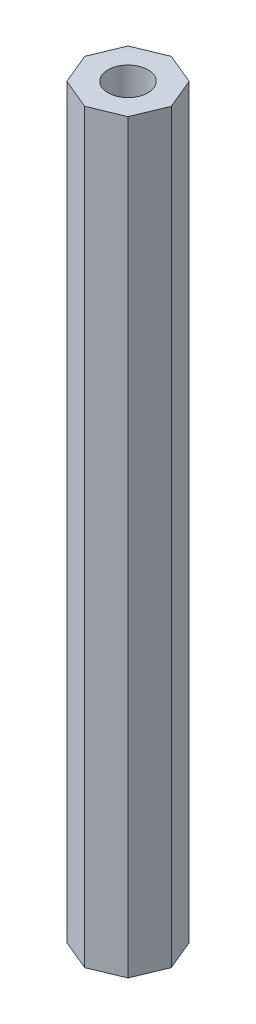
ISO-10303-21;
HEADER;
FILE_DESCRIPTION(('STEP AP214'),'2;1');
FILE_NAME('part.step','',(''),(''),'','','');
FILE_SCHEMA(('AUTOMOTIVE_DESIGN { 1 0 10303 214 1 1 1 1 }'));
ENDSEC;
DATA;
#1=APPLICATION_CONTEXT('core data for automotive mechanical design processes');
#2=APPLICATION_PROTOCOL_DEFINITION('international standard','automotive_design',2000,#1);
#3=PRODUCT_CONTEXT('',#1,'mechanical');
#4=PRODUCT('Part','Part','',(#3));
#5=PRODUCT_RELATED_PRODUCT_CATEGORY('part','',(#4));
#6=PRODUCT_DEFINITION_FORMATION('','',#4);
#7=PRODUCT_DEFINITION_CONTEXT('part definition',#1,'design');
#8=PRODUCT_DEFINITION('design','',#6,#7);
#9=PRODUCT_DEFINITION_SHAPE('','',#8);
#10=(LENGTH_UNIT() NAMED_UNIT(*) SI_UNIT(.MILLI.,.METRE.));
#11=(NAMED_UNIT(*) PLANE_ANGLE_UNIT() SI_UNIT($,.RADIAN.));
#12=(NAMED_UNIT(*) SI_UNIT($,.STERADIAN.) SOLID_ANGLE_UNIT());
#13=UNCERTAINTY_MEASURE_WITH_UNIT(LENGTH_MEASURE(1.E-05),#10,'distance_accuracy_value','');
#14=(GEOMETRIC_REPRESENTATION_CONTEXT(3) GLOBAL_UNCERTAINTY_ASSIGNED_CONTEXT((#13)) GLOBAL_UNIT_ASSIGNED_CONTEXT((#10,
#11,#12)) REPRESENTATION_CONTEXT('',''));
#15=CARTESIAN_POINT('',(0.,0.,0.));
#16=DIRECTION('',(0.,0.,1.));
#17=DIRECTION('',(1.,0.,0.));
#18=AXIS2_PLACEMENT_3D('',#15,#16,#17);
#19=CARTESIAN_POINT('',(0.,28.,0.));
#20=DIRECTION('',(0.,1.,0.));
#21=DIRECTION('',(0.,0.,1.));
#22=AXIS2_PLACEMENT_3D('',#19,#20,#21);
#23=PLANE('',#22);
#24=DIRECTION('',(0.382683432365078,0.,-0.923879532511292));
#25=VECTOR('',#24,1.);
#26=CARTESIAN_POINT('',(1.14805029709528,28.,1.14805029709526));
#27=LINE('',#26,#25);
#28=CARTESIAN_POINT('',(1.14805029709528,28.,1.14805029709526));
#29=VERTEX_POINT('',#28);
#30=CARTESIAN_POINT('',(1.62358830043859,28.,0.));
#31=VERTEX_POINT('',#30);
#32=EDGE_CURVE('E144',#29,#31,#27,.T.);
#33=ORIENTED_EDGE('',*,*,#32,.T.);
#34=DIRECTION('',(-0.382683432365101,0.,-0.923879532511282));
#35=VECTOR('',#34,1.);
#36=CARTESIAN_POINT('',(1.62358830043859,28.,0.));
#37=LINE('',#36,#35);
#38=CARTESIAN_POINT('',(1.14805029709525,28.,-1.14805029709528));
#39=VERTEX_POINT('',#38);
#40=EDGE_CURVE('E92',#31,#39,#37,.T.);
#41=ORIENTED_EDGE('',*,*,#40,.T.);
#42=DIRECTION('',(-0.923879532511292,0.,-0.382683432365078));
#43=VECTOR('',#42,1.);
#44=CARTESIAN_POINT('',(1.14805029709525,28.,-1.14805029709528));
#45=LINE('',#44,#43);
#46=CARTESIAN_POINT('',(0.,28.,-1.62358830043859));
#47=VERTEX_POINT('',#46);
#48=EDGE_CURVE('E159',#39,#47,#45,.T.);
#49=ORIENTED_EDGE('',*,*,#48,.T.);
#50=DIRECTION('',(-0.923879532511282,0.,0.382683432365101));
#51=VECTOR('',#50,1.);
#52=CARTESIAN_POINT('',(0.,28.,-1.62358830043859));
#53=LINE('',#52,#51);
#54=CARTESIAN_POINT('',(-1.14805029709528,28.,-1.14805029709526));
#55=VERTEX_POINT('',#54);
#56=EDGE_CURVE('E172',#47,#55,#53,.T.);
#57=ORIENTED_EDGE('',*,*,#56,.T.);
#58=DIRECTION('',(-0.382683432365078,0.,0.923879532511292));
#59=VECTOR('',#58,1.);
#60=CARTESIAN_POINT('',(-1.14805029709528,28.,-1.14805029709526));
#61=LINE('',#60,#59);
#62=CARTESIAN_POINT('',(-1.62358830043859,28.,0.));
#63=VERTEX_POINT('',#62);
#64=EDGE_CURVE('E111',#55,#63,#61,.T.);
#65=ORIENTED_EDGE('',*,*,#64,.T.);
#66=DIRECTION('',(0.382683432365101,0.,0.923879532511282));
#67=VECTOR('',#66,1.);
#68=CARTESIAN_POINT('',(-1.62358830043859,28.,0.));
#69=LINE('',#68,#67);
#70=CARTESIAN_POINT('',(-1.14805029709526,28.,1.14805029709528));
#71=VERTEX_POINT('',#70);
#72=EDGE_CURVE('E105',#63,#71,#69,.T.);
#73=ORIENTED_EDGE('',*,*,#72,.T.);
#74=DIRECTION('',(0.923879532511292,0.,0.382683432365078));
#75=VECTOR('',#74,1.);
#76=CARTESIAN_POINT('',(-1.14805029709526,28.,1.14805029709528));
#77=LINE('',#76,#75);
#78=CARTESIAN_POINT('',(0.,28.,1.62358830043859));
#79=VERTEX_POINT('',#78);
#80=EDGE_CURVE('E109',#71,#79,#77,.T.);
#81=ORIENTED_EDGE('',*,*,#80,.T.);
#82=DIRECTION('',(0.923879532511282,0.,-0.382683432365101));
#83=VECTOR('',#82,1.);
#84=CARTESIAN_POINT('',(0.,28.,1.62358830043859));
#85=LINE('',#84,#83);
#86=EDGE_CURVE('E49',#79,#29,#85,.T.);
#87=ORIENTED_EDGE('',*,*,#86,.T.);
#88=EDGE_LOOP('',(#33,#41,#49,#57,#65,#73,#81,#87));
#89=FACE_BOUND('',#88,.T.);
#90=CARTESIAN_POINT('',(0.,28.,0.));
#91=DIRECTION('',(0.,1.,0.));
#92=DIRECTION('',(0.,0.,1.));
#93=AXIS2_PLACEMENT_3D('',#90,#91,#92);
#94=CIRCLE('',#93,0.75);
#95=CARTESIAN_POINT('',(0.,28.,0.75));
#96=VERTEX_POINT('',#95);
#97=EDGE_CURVE('E133',#96,#96,#94,.T.);
#98=ORIENTED_EDGE('',*,*,#97,.F.);
#99=EDGE_LOOP('',(#98));
#100=FACE_BOUND('',#99,.T.);
#101=ADVANCED_FACE('F32',(#89,#100),#23,.T.);
#102=CARTESIAN_POINT('',(0.,0.,0.));
#103=DIRECTION('',(0.,1.,0.));
#104=DIRECTION('',(0.,0.,1.));
#105=AXIS2_PLACEMENT_3D('',#102,#103,#104);
#106=PLANE('',#105);
#107=DIRECTION('',(0.382683432365078,0.,-0.923879532511292));
#108=VECTOR('',#107,1.);
#109=CARTESIAN_POINT('',(1.14805029709528,0.,1.14805029709526));
#110=LINE('',#109,#108);
#111=CARTESIAN_POINT('',(1.14805029709528,0.,1.14805029709526));
#112=VERTEX_POINT('',#111);
#113=CARTESIAN_POINT('',(1.62358830043859,0.,0.));
#114=VERTEX_POINT('',#113);
#115=EDGE_CURVE('E129',#112,#114,#110,.T.);
#116=ORIENTED_EDGE('',*,*,#115,.F.);
#117=DIRECTION('',(0.923879532511282,0.,-0.382683432365101));
#118=VECTOR('',#117,1.);
#119=CARTESIAN_POINT('',(0.,0.,1.62358830043859));
#120=LINE('',#119,#118);
#121=CARTESIAN_POINT('',(0.,0.,1.62358830043859));
#122=VERTEX_POINT('',#121);
#123=EDGE_CURVE('E84',#122,#112,#120,.T.);
#124=ORIENTED_EDGE('',*,*,#123,.F.);
#125=DIRECTION('',(0.923879532511292,0.,0.382683432365078));
#126=VECTOR('',#125,1.);
#127=CARTESIAN_POINT('',(-1.14805029709526,0.,1.14805029709528));
#128=LINE('',#127,#126);
#129=CARTESIAN_POINT('',(-1.14805029709526,0.,1.14805029709528));
#130=VERTEX_POINT('',#129);
#131=EDGE_CURVE('E78',#130,#122,#128,.T.);
#132=ORIENTED_EDGE('',*,*,#131,.F.);
#133=DIRECTION('',(0.382683432365101,0.,0.923879532511282));
#134=VECTOR('',#133,1.);
#135=CARTESIAN_POINT('',(-1.62358830043859,0.,0.));
#136=LINE('',#135,#134);
#137=CARTESIAN_POINT('',(-1.62358830043859,0.,0.));
#138=VERTEX_POINT('',#137);
#139=EDGE_CURVE('E119',#138,#130,#136,.T.);
#140=ORIENTED_EDGE('',*,*,#139,.F.);
#141=DIRECTION('',(-0.382683432365078,0.,0.923879532511292));
#142=VECTOR('',#141,1.);
#143=CARTESIAN_POINT('',(-1.14805029709528,0.,-1.14805029709526));
#144=LINE('',#143,#142);
#145=CARTESIAN_POINT('',(-1.14805029709528,0.,-1.14805029709526));
#146=VERTEX_POINT('',#145);
#147=EDGE_CURVE('E139',#146,#138,#144,.T.);
#148=ORIENTED_EDGE('',*,*,#147,.F.);
#149=DIRECTION('',(-0.923879532511282,0.,0.382683432365101));
#150=VECTOR('',#149,1.);
#151=CARTESIAN_POINT('',(0.,0.,-1.62358830043859));
#152=LINE('',#151,#150);
#153=CARTESIAN_POINT('',(0.,0.,-1.62358830043859));
#154=VERTEX_POINT('',#153);
#155=EDGE_CURVE('E137',#154,#146,#152,.T.);
#156=ORIENTED_EDGE('',*,*,#155,.F.);
#157=DIRECTION('',(-0.923879532511292,0.,-0.382683432365078));
#158=VECTOR('',#157,1.);
#159=CARTESIAN_POINT('',(1.14805029709525,0.,-1.14805029709528));
#160=LINE('',#159,#158);
#161=CARTESIAN_POINT('',(1.14805029709525,0.,-1.14805029709528));
#162=VERTEX_POINT('',#161);
#163=EDGE_CURVE('E135',#162,#154,#160,.T.);
#164=ORIENTED_EDGE('',*,*,#163,.F.);
#165=DIRECTION('',(-0.382683432365101,0.,-0.923879532511282));
#166=VECTOR('',#165,1.);
#167=CARTESIAN_POINT('',(1.62358830043859,0.,0.));
#168=LINE('',#167,#166);
#169=EDGE_CURVE('E132',#114,#162,#168,.T.);
#170=ORIENTED_EDGE('',*,*,#169,.F.);
#171=EDGE_LOOP('',(#116,#124,#132,#140,#148,#156,#164,#170));
#172=FACE_BOUND('',#171,.T.);
#173=CARTESIAN_POINT('',(0.,0.,0.));
#174=DIRECTION('',(0.,1.,0.));
#175=DIRECTION('',(0.,0.,1.));
#176=AXIS2_PLACEMENT_3D('',#173,#174,#175);
#177=CIRCLE('',#176,0.75);
#178=CARTESIAN_POINT('',(0.,0.,0.75));
#179=VERTEX_POINT('',#178);
#180=EDGE_CURVE('E178',#179,#179,#177,.T.);
#181=ORIENTED_EDGE('',*,*,#180,.T.);
#182=EDGE_LOOP('',(#181));
#183=FACE_BOUND('',#182,.T.);
#184=ADVANCED_FACE('F163',(#172,#183),#106,.F.);
#185=CARTESIAN_POINT('',(1.14805029709528,28.,1.14805029709526));
#186=DIRECTION('',(-0.923879532511292,0.,-0.382683432365078));
#187=DIRECTION('',(-0.382683432365078,0.,0.923879532511292));
#188=AXIS2_PLACEMENT_3D('',#185,#186,#187);
#189=PLANE('',#188);
#190=ORIENTED_EDGE('',*,*,#115,.T.);
#191=DIRECTION('',(0.,-1.,0.));
#192=VECTOR('',#191,1.);
#193=CARTESIAN_POINT('',(1.62358830043859,28.,0.));
#194=LINE('',#193,#192);
#195=EDGE_CURVE('E11',#31,#114,#194,.T.);
#196=ORIENTED_EDGE('',*,*,#195,.F.);
#197=ORIENTED_EDGE('',*,*,#32,.F.);
#198=DIRECTION('',(0.,-1.,0.));
#199=VECTOR('',#198,1.);
#200=CARTESIAN_POINT('',(1.14805029709528,28.,1.14805029709526));
#201=LINE('',#200,#199);
#202=EDGE_CURVE('E125',#29,#112,#201,.T.);
#203=ORIENTED_EDGE('',*,*,#202,.T.);
#204=EDGE_LOOP('',(#190,#196,#197,#203));
#205=FACE_BOUND('',#204,.T.);
#206=ADVANCED_FACE('F34',(#205),#189,.F.);
#207=CARTESIAN_POINT('',(1.62358830043859,28.,0.));
#208=DIRECTION('',(-0.923879532511282,0.,0.382683432365101));
#209=DIRECTION('',(0.382683432365101,0.,0.923879532511282));
#210=AXIS2_PLACEMENT_3D('',#207,#208,#209);
#211=PLANE('',#210);
#212=ORIENTED_EDGE('',*,*,#169,.T.);
#213=DIRECTION('',(0.,-1.,0.));
#214=VECTOR('',#213,1.);
#215=CARTESIAN_POINT('',(1.14805029709525,28.,-1.14805029709528));
#216=LINE('',#215,#214);
#217=EDGE_CURVE('E41',#39,#162,#216,.T.);
#218=ORIENTED_EDGE('',*,*,#217,.F.);
#219=ORIENTED_EDGE('',*,*,#40,.F.);
#220=ORIENTED_EDGE('',*,*,#195,.T.);
#221=EDGE_LOOP('',(#212,#218,#219,#220));
#222=FACE_BOUND('',#221,.T.);
#223=ADVANCED_FACE('F206',(#222),#211,.F.);
#224=CARTESIAN_POINT('',(1.14805029709525,28.,-1.14805029709528));
#225=DIRECTION('',(-0.382683432365078,0.,0.923879532511292));
#226=DIRECTION('',(0.923879532511292,0.,0.382683432365078));
#227=AXIS2_PLACEMENT_3D('',#224,#225,#226);
#228=PLANE('',#227);
#229=ORIENTED_EDGE('',*,*,#163,.T.);
#230=DIRECTION('',(0.,-1.,0.));
#231=VECTOR('',#230,1.);
#232=CARTESIAN_POINT('',(0.,28.,-1.62358830043859));
#233=LINE('',#232,#231);
#234=EDGE_CURVE('E151',#47,#154,#233,.T.);
#235=ORIENTED_EDGE('',*,*,#234,.F.);
#236=ORIENTED_EDGE('',*,*,#48,.F.);
#237=ORIENTED_EDGE('',*,*,#217,.T.);
#238=EDGE_LOOP('',(#229,#235,#236,#237));
#239=FACE_BOUND('',#238,.T.);
#240=ADVANCED_FACE('F157',(#239),#228,.F.);
#241=CARTESIAN_POINT('',(0.,28.,-1.62358830043859));
#242=DIRECTION('',(0.382683432365101,0.,0.923879532511282));
#243=DIRECTION('',(0.923879532511282,0.,-0.382683432365101));
#244=AXIS2_PLACEMENT_3D('',#241,#242,#243);
#245=PLANE('',#244);
#246=ORIENTED_EDGE('',*,*,#155,.T.);
#247=DIRECTION('',(0.,-1.,0.));
#248=VECTOR('',#247,1.);
#249=CARTESIAN_POINT('',(-1.14805029709528,28.,-1.14805029709526));
#250=LINE('',#249,#248);
#251=EDGE_CURVE('E148',#55,#146,#250,.T.);
#252=ORIENTED_EDGE('',*,*,#251,.F.);
#253=ORIENTED_EDGE('',*,*,#56,.F.);
#254=ORIENTED_EDGE('',*,*,#234,.T.);
#255=EDGE_LOOP('',(#246,#252,#253,#254));
#256=FACE_BOUND('',#255,.T.);
#257=ADVANCED_FACE('F168',(#256),#245,.F.);
#258=CARTESIAN_POINT('',(-1.14805029709528,28.,-1.14805029709526));
#259=DIRECTION('',(0.923879532511292,0.,0.382683432365078));
#260=DIRECTION('',(0.382683432365078,0.,-0.923879532511292));
#261=AXIS2_PLACEMENT_3D('',#258,#259,#260);
#262=PLANE('',#261);
#263=ORIENTED_EDGE('',*,*,#147,.T.);
#264=DIRECTION('',(0.,-1.,0.));
#265=VECTOR('',#264,1.);
#266=CARTESIAN_POINT('',(-1.62358830043859,28.,0.));
#267=LINE('',#266,#265);
#268=EDGE_CURVE('E120',#63,#138,#267,.T.);
#269=ORIENTED_EDGE('',*,*,#268,.F.);
#270=ORIENTED_EDGE('',*,*,#64,.F.);
#271=ORIENTED_EDGE('',*,*,#251,.T.);
#272=EDGE_LOOP('',(#263,#269,#270,#271));
#273=FACE_BOUND('',#272,.T.);
#274=ADVANCED_FACE('F171',(#273),#262,.F.);
#275=CARTESIAN_POINT('',(-1.62358830043859,28.,0.));
#276=DIRECTION('',(0.923879532511282,0.,-0.382683432365101));
#277=DIRECTION('',(-0.382683432365101,0.,-0.923879532511282));
#278=AXIS2_PLACEMENT_3D('',#275,#276,#277);
#279=PLANE('',#278);
#280=ORIENTED_EDGE('',*,*,#139,.T.);
#281=DIRECTION('',(0.,-1.,0.));
#282=VECTOR('',#281,1.);
#283=CARTESIAN_POINT('',(-1.14805029709526,28.,1.14805029709528));
#284=LINE('',#283,#282);
#285=EDGE_CURVE('E116',#71,#130,#284,.T.);
#286=ORIENTED_EDGE('',*,*,#285,.F.);
#287=ORIENTED_EDGE('',*,*,#72,.F.);
#288=ORIENTED_EDGE('',*,*,#268,.T.);
#289=EDGE_LOOP('',(#280,#286,#287,#288));
#290=FACE_BOUND('',#289,.T.);
#291=ADVANCED_FACE('F117',(#290),#279,.F.);
#292=CARTESIAN_POINT('',(-1.14805029709526,28.,1.14805029709528));
#293=DIRECTION('',(0.382683432365078,0.,-0.923879532511292));
#294=DIRECTION('',(-0.923879532511292,0.,-0.382683432365078));
#295=AXIS2_PLACEMENT_3D('',#292,#293,#294);
#296=PLANE('',#295);
#297=ORIENTED_EDGE('',*,*,#131,.T.);
#298=DIRECTION('',(0.,-1.,0.));
#299=VECTOR('',#298,1.);
#300=CARTESIAN_POINT('',(0.,28.,1.62358830043859));
#301=LINE('',#300,#299);
#302=EDGE_CURVE('E121',#79,#122,#301,.T.);
#303=ORIENTED_EDGE('',*,*,#302,.F.);
#304=ORIENTED_EDGE('',*,*,#80,.F.);
#305=ORIENTED_EDGE('',*,*,#285,.T.);
#306=EDGE_LOOP('',(#297,#303,#304,#305));
#307=FACE_BOUND('',#306,.T.);
#308=ADVANCED_FACE('F123',(#307),#296,.F.);
#309=CARTESIAN_POINT('',(0.,28.,1.62358830043859));
#310=DIRECTION('',(-0.382683432365101,0.,-0.923879532511282));
#311=DIRECTION('',(-0.923879532511282,0.,0.382683432365101));
#312=AXIS2_PLACEMENT_3D('',#309,#310,#311);
#313=PLANE('',#312);
#314=ORIENTED_EDGE('',*,*,#123,.T.);
#315=ORIENTED_EDGE('',*,*,#202,.F.);
#316=ORIENTED_EDGE('',*,*,#86,.F.);
#317=ORIENTED_EDGE('',*,*,#302,.T.);
#318=EDGE_LOOP('',(#314,#315,#316,#317));
#319=FACE_BOUND('',#318,.T.);
#320=ADVANCED_FACE('F194',(#319),#313,.F.);
#321=CARTESIAN_POINT('',(0.,28.,0.));
#322=DIRECTION('',(0.,-1.,0.));
#323=DIRECTION('',(0.,0.,-1.));
#324=AXIS2_PLACEMENT_3D('',#321,#322,#323);
#325=CYLINDRICAL_SURFACE('',#324,0.75);
#326=ORIENTED_EDGE('',*,*,#97,.T.);
#327=EDGE_LOOP('',(#326));
#328=FACE_BOUND('',#327,.T.);
#329=ORIENTED_EDGE('',*,*,#180,.F.);
#330=EDGE_LOOP('',(#329));
#331=FACE_BOUND('',#330,.T.);
#332=ADVANCED_FACE('F184',(#328,#331),#325,.F.);
#333=CLOSED_SHELL('',(#101,#184,#206,#223,#240,#257,#274,#291,#308,#320,#332));
#334=MANIFOLD_SOLID_BREP('B2',#333);
#335=ADVANCED_BREP_SHAPE_REPRESENTATION('',(#18,#334),#14);
#336=SHAPE_DEFINITION_REPRESENTATION(#9,#335);
ENDSEC;
END-ISO-10303-21;
